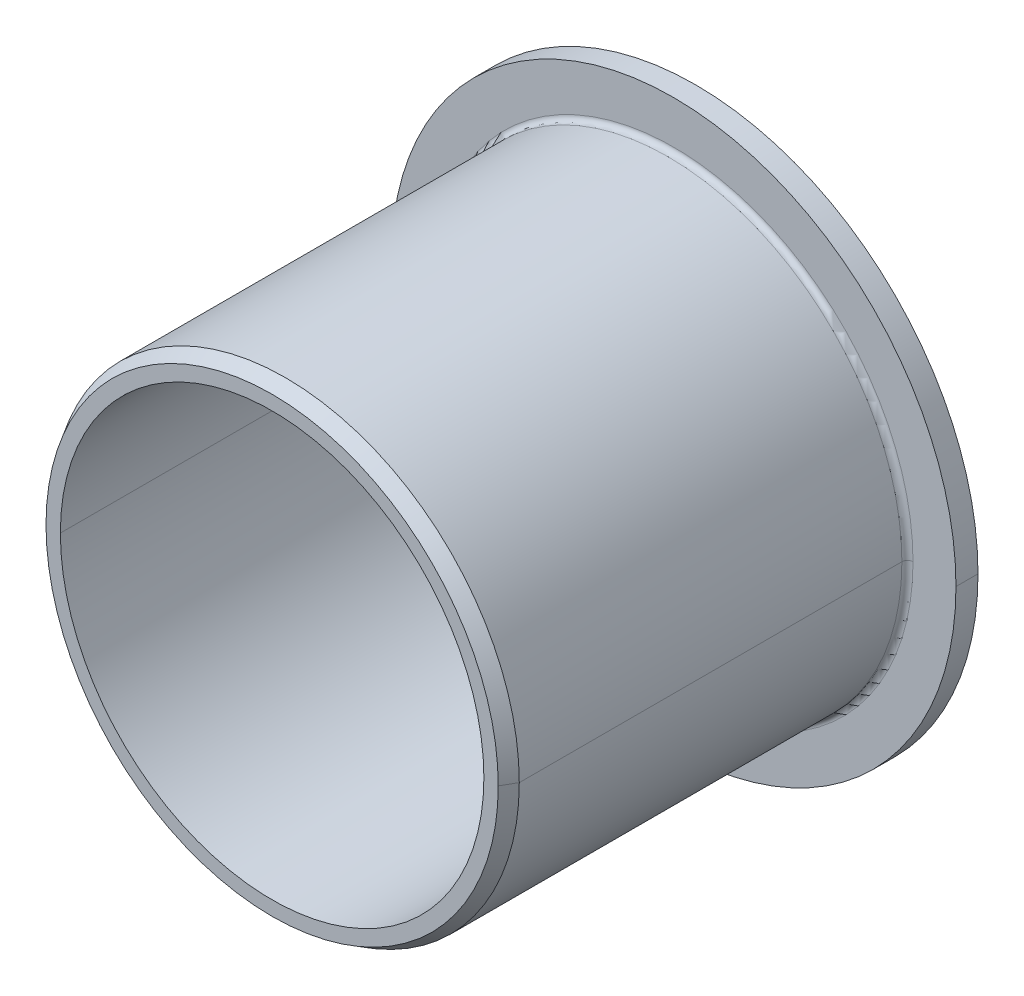
ISO-10303-21;
HEADER;
FILE_DESCRIPTION(('STEP AP214'),'2;1');
FILE_NAME('part.step','',(''),(''),'','','');
FILE_SCHEMA(('AUTOMOTIVE_DESIGN { 1 0 10303 214 1 1 1 1 }'));
ENDSEC;
DATA;
#1=APPLICATION_CONTEXT('core data for automotive mechanical design processes');
#2=APPLICATION_PROTOCOL_DEFINITION('international standard','automotive_design',2000,#1);
#3=PRODUCT_CONTEXT('',#1,'mechanical');
#4=PRODUCT('Part','Part','',(#3));
#5=PRODUCT_RELATED_PRODUCT_CATEGORY('part','',(#4));
#6=PRODUCT_DEFINITION_FORMATION('','',#4);
#7=PRODUCT_DEFINITION_CONTEXT('part definition',#1,'design');
#8=PRODUCT_DEFINITION('design','',#6,#7);
#9=PRODUCT_DEFINITION_SHAPE('','',#8);
#10=(LENGTH_UNIT() NAMED_UNIT(*) SI_UNIT(.MILLI.,.METRE.));
#11=(NAMED_UNIT(*) PLANE_ANGLE_UNIT() SI_UNIT($,.RADIAN.));
#12=(NAMED_UNIT(*) SI_UNIT($,.STERADIAN.) SOLID_ANGLE_UNIT());
#13=UNCERTAINTY_MEASURE_WITH_UNIT(LENGTH_MEASURE(1.E-05),#10,'distance_accuracy_value','');
#14=(GEOMETRIC_REPRESENTATION_CONTEXT(3) GLOBAL_UNCERTAINTY_ASSIGNED_CONTEXT((#13)) GLOBAL_UNIT_ASSIGNED_CONTEXT((#10,
#11,#12)) REPRESENTATION_CONTEXT('',''));
#15=CARTESIAN_POINT('',(0.,0.,0.));
#16=DIRECTION('',(0.,0.,1.));
#17=DIRECTION('',(1.,0.,0.));
#18=AXIS2_PLACEMENT_3D('',#15,#16,#17);
#19=CARTESIAN_POINT('',(22.225,0.,0.));
#20=DIRECTION('',(0.,0.,-1.));
#21=DIRECTION('',(0.,-1.,0.));
#22=AXIS2_PLACEMENT_3D('',#19,#20,#21);
#23=PLANE('',#22);
#24=CARTESIAN_POINT('',(0.,0.,0.));
#25=DIRECTION('',(0.,0.,1.));
#26=DIRECTION('',(1.,0.,0.));
#27=AXIS2_PLACEMENT_3D('',#24,#25,#26);
#28=CIRCLE('',#27,19.05);
#29=CARTESIAN_POINT('',(19.05,0.,0.));
#30=VERTEX_POINT('',#29);
#31=CARTESIAN_POINT('',(-19.05,0.,0.));
#32=VERTEX_POINT('',#31);
#33=EDGE_CURVE('E11',#30,#32,#28,.T.);
#34=ORIENTED_EDGE('',*,*,#33,.T.);
#35=CARTESIAN_POINT('',(0.,0.,0.));
#36=DIRECTION('',(0.,0.,1.));
#37=DIRECTION('',(1.,0.,0.));
#38=AXIS2_PLACEMENT_3D('',#35,#36,#37);
#39=CIRCLE('',#38,19.05);
#40=EDGE_CURVE('E163',#32,#30,#39,.T.);
#41=ORIENTED_EDGE('',*,*,#40,.T.);
#42=EDGE_LOOP('',(#34,#41));
#43=FACE_BOUND('',#42,.T.);
#44=CARTESIAN_POINT('',(0.,0.,0.));
#45=DIRECTION('',(0.,0.,1.));
#46=DIRECTION('',(1.,0.,0.));
#47=AXIS2_PLACEMENT_3D('',#44,#45,#46);
#48=CIRCLE('',#47,25.4);
#49=CARTESIAN_POINT('',(25.4,0.,0.));
#50=VERTEX_POINT('',#49);
#51=CARTESIAN_POINT('',(-25.4,0.,0.));
#52=VERTEX_POINT('',#51);
#53=EDGE_CURVE('E185',#50,#52,#48,.T.);
#54=ORIENTED_EDGE('',*,*,#53,.F.);
#55=CARTESIAN_POINT('',(0.,0.,0.));
#56=DIRECTION('',(0.,0.,1.));
#57=DIRECTION('',(1.,0.,0.));
#58=AXIS2_PLACEMENT_3D('',#55,#56,#57);
#59=CIRCLE('',#58,25.4);
#60=EDGE_CURVE('E160',#52,#50,#59,.T.);
#61=ORIENTED_EDGE('',*,*,#60,.F.);
#62=EDGE_LOOP('',(#54,#61));
#63=FACE_BOUND('',#62,.T.);
#64=ADVANCED_FACE('F16',(#43,#63),#23,.T.);
#65=CARTESIAN_POINT('',(0.,0.,19.05));
#66=DIRECTION('',(0.,0.,1.));
#67=DIRECTION('',(1.,0.,0.));
#68=AXIS2_PLACEMENT_3D('',#65,#66,#67);
#69=CYLINDRICAL_SURFACE('',#68,19.05);
#70=DIRECTION('',(0.,0.,1.));
#71=VECTOR('',#70,1.);
#72=CARTESIAN_POINT('',(19.05,0.,19.05));
#73=LINE('',#72,#71);
#74=CARTESIAN_POINT('',(19.05,0.,38.1));
#75=VERTEX_POINT('',#74);
#76=EDGE_CURVE('E167',#30,#75,#73,.T.);
#77=ORIENTED_EDGE('',*,*,#76,.T.);
#78=CARTESIAN_POINT('',(0.,0.,38.1));
#79=DIRECTION('',(0.,0.,1.));
#80=DIRECTION('',(1.,0.,0.));
#81=AXIS2_PLACEMENT_3D('',#78,#79,#80);
#82=CIRCLE('',#81,19.05);
#83=CARTESIAN_POINT('',(-19.05,0.,38.1));
#84=VERTEX_POINT('',#83);
#85=EDGE_CURVE('E27',#75,#84,#82,.T.);
#86=ORIENTED_EDGE('',*,*,#85,.T.);
#87=DIRECTION('',(0.,0.,-1.));
#88=VECTOR('',#87,1.);
#89=CARTESIAN_POINT('',(-19.05,0.,19.05));
#90=LINE('',#89,#88);
#91=EDGE_CURVE('E166',#84,#32,#90,.T.);
#92=ORIENTED_EDGE('',*,*,#91,.T.);
#93=ORIENTED_EDGE('',*,*,#33,.F.);
#94=EDGE_LOOP('',(#77,#86,#92,#93));
#95=FACE_BOUND('',#94,.T.);
#96=ADVANCED_FACE('F231',(#95),#69,.F.);
#97=CARTESIAN_POINT('',(19.6957773385,0.,38.1));
#98=DIRECTION('',(0.,0.,1.));
#99=DIRECTION('',(1.,0.,0.));
#100=AXIS2_PLACEMENT_3D('',#97,#98,#99);
#101=PLANE('',#100);
#102=ORIENTED_EDGE('',*,*,#85,.F.);
#103=CARTESIAN_POINT('',(0.,0.,38.1));
#104=DIRECTION('',(0.,0.,1.));
#105=DIRECTION('',(1.,0.,0.));
#106=AXIS2_PLACEMENT_3D('',#103,#104,#105);
#107=CIRCLE('',#106,19.05);
#108=EDGE_CURVE('E20',#84,#75,#107,.T.);
#109=ORIENTED_EDGE('',*,*,#108,.F.);
#110=EDGE_LOOP('',(#102,#109));
#111=FACE_BOUND('',#110,.T.);
#112=CARTESIAN_POINT('',(0.,0.,38.1));
#113=DIRECTION('',(0.,0.,1.));
#114=DIRECTION('',(1.,0.,0.));
#115=AXIS2_PLACEMENT_3D('',#112,#113,#114);
#116=CIRCLE('',#115,20.341554677);
#117=CARTESIAN_POINT('',(20.341554677,0.,38.1));
#118=VERTEX_POINT('',#117);
#119=CARTESIAN_POINT('',(-20.341554677,0.,38.1));
#120=VERTEX_POINT('',#119);
#121=EDGE_CURVE('E148',#118,#120,#116,.T.);
#122=ORIENTED_EDGE('',*,*,#121,.T.);
#123=CARTESIAN_POINT('',(0.,0.,38.1));
#124=DIRECTION('',(0.,0.,1.));
#125=DIRECTION('',(1.,0.,0.));
#126=AXIS2_PLACEMENT_3D('',#123,#124,#125);
#127=CIRCLE('',#126,20.341554677);
#128=EDGE_CURVE('E105',#120,#118,#127,.T.);
#129=ORIENTED_EDGE('',*,*,#128,.T.);
#130=EDGE_LOOP('',(#122,#129));
#131=FACE_BOUND('',#130,.T.);
#132=ADVANCED_FACE('F237',(#111,#131),#101,.T.);
#133=CARTESIAN_POINT('',(0.,0.,37.5));
#134=DIRECTION('',(0.,0.,-1.));
#135=DIRECTION('',(1.,0.,0.));
#136=AXIS2_PLACEMENT_3D('',#133,#134,#135);
#137=CONICAL_SURFACE('',#136,20.6879648385,0.523598775581078);
#138=DIRECTION('',(-0.499999999985086,0.,0.866025403793049));
#139=VECTOR('',#138,1.);
#140=CARTESIAN_POINT('',(20.6879648385,0.,37.5));
#141=LINE('',#140,#139);
#142=CARTESIAN_POINT('',(21.034375,0.,36.9));
#143=VERTEX_POINT('',#142);
#144=EDGE_CURVE('E184',#143,#118,#141,.T.);
#145=ORIENTED_EDGE('',*,*,#144,.T.);
#146=ORIENTED_EDGE('',*,*,#128,.F.);
#147=DIRECTION('',(-0.499999999985086,0.,-0.866025403793049));
#148=VECTOR('',#147,1.);
#149=CARTESIAN_POINT('',(-20.6879648385,0.,37.5));
#150=LINE('',#149,#148);
#151=CARTESIAN_POINT('',(-21.034375,0.,36.9));
#152=VERTEX_POINT('',#151);
#153=EDGE_CURVE('E154',#120,#152,#150,.T.);
#154=ORIENTED_EDGE('',*,*,#153,.T.);
#155=CARTESIAN_POINT('',(0.,0.,36.9));
#156=DIRECTION('',(0.,0.,1.));
#157=DIRECTION('',(1.,0.,0.));
#158=AXIS2_PLACEMENT_3D('',#155,#156,#157);
#159=CIRCLE('',#158,21.034375);
#160=EDGE_CURVE('E80',#152,#143,#159,.T.);
#161=ORIENTED_EDGE('',*,*,#160,.T.);
#162=EDGE_LOOP('',(#145,#146,#154,#161));
#163=FACE_BOUND('',#162,.T.);
#164=ADVANCED_FACE('F242',(#163),#137,.T.);
#165=CARTESIAN_POINT('',(0.,0.,19.6906));
#166=DIRECTION('',(0.,0.,1.));
#167=DIRECTION('',(1.,0.,0.));
#168=AXIS2_PLACEMENT_3D('',#165,#166,#167);
#169=CYLINDRICAL_SURFACE('',#168,21.034375);
#170=DIRECTION('',(0.,0.,1.));
#171=VECTOR('',#170,1.);
#172=CARTESIAN_POINT('',(21.034375,0.,19.6906));
#173=LINE('',#172,#171);
#174=CARTESIAN_POINT('',(21.034375,0.,2.4812));
#175=VERTEX_POINT('',#174);
#176=EDGE_CURVE('E116',#175,#143,#173,.T.);
#177=ORIENTED_EDGE('',*,*,#176,.T.);
#178=ORIENTED_EDGE('',*,*,#160,.F.);
#179=DIRECTION('',(0.,0.,-1.));
#180=VECTOR('',#179,1.);
#181=CARTESIAN_POINT('',(-21.034375,0.,19.6906));
#182=LINE('',#181,#180);
#183=CARTESIAN_POINT('',(-21.034375,0.,2.4812));
#184=VERTEX_POINT('',#183);
#185=EDGE_CURVE('E119',#152,#184,#182,.T.);
#186=ORIENTED_EDGE('',*,*,#185,.T.);
#187=CARTESIAN_POINT('',(0.,0.,2.4812));
#188=DIRECTION('',(0.,0.,1.));
#189=DIRECTION('',(1.,0.,0.));
#190=AXIS2_PLACEMENT_3D('',#187,#188,#189);
#191=CIRCLE('',#190,21.034375);
#192=EDGE_CURVE('E112',#184,#175,#191,.T.);
#193=ORIENTED_EDGE('',*,*,#192,.T.);
#194=EDGE_LOOP('',(#177,#178,#186,#193));
#195=FACE_BOUND('',#194,.T.);
#196=ADVANCED_FACE('F114',(#195),#169,.T.);
#197=CARTESIAN_POINT('',(0.,0.,2.4812));
#198=DIRECTION('',(0.,0.,1.));
#199=DIRECTION('',(1.,0.,0.));
#200=AXIS2_PLACEMENT_3D('',#197,#198,#199);
#201=TOROIDAL_SURFACE('',#200,21.534375,0.499999999999986);
#202=CARTESIAN_POINT('',(-21.534375,0.,2.4812));
#203=DIRECTION('',(0.,-1.,0.));
#204=DIRECTION('',(-1.,0.,0.));
#205=AXIS2_PLACEMENT_3D('',#202,#203,#204);
#206=CIRCLE('',#205,0.499999999999986);
#207=CARTESIAN_POINT('',(-21.534375,0.,1.9812));
#208=VERTEX_POINT('',#207);
#209=EDGE_CURVE('E139',#208,#184,#206,.T.);
#210=ORIENTED_EDGE('',*,*,#209,.T.);
#211=CARTESIAN_POINT('',(0.,0.,2.4812));
#212=DIRECTION('',(0.,0.,1.));
#213=DIRECTION('',(1.,0.,0.));
#214=AXIS2_PLACEMENT_3D('',#211,#212,#213);
#215=CIRCLE('',#214,21.034375);
#216=EDGE_CURVE('E137',#175,#184,#215,.T.);
#217=ORIENTED_EDGE('',*,*,#216,.F.);
#218=CARTESIAN_POINT('',(21.534375,0.,2.4812));
#219=DIRECTION('',(0.,-1.,0.));
#220=DIRECTION('',(1.,0.,0.));
#221=AXIS2_PLACEMENT_3D('',#218,#219,#220);
#222=CIRCLE('',#221,0.499999999999986);
#223=CARTESIAN_POINT('',(21.534375,0.,1.9812));
#224=VERTEX_POINT('',#223);
#225=EDGE_CURVE('E126',#175,#224,#222,.T.);
#226=ORIENTED_EDGE('',*,*,#225,.T.);
#227=CARTESIAN_POINT('',(0.,0.,1.9812));
#228=DIRECTION('',(0.,0.,1.));
#229=DIRECTION('',(1.,0.,0.));
#230=AXIS2_PLACEMENT_3D('',#227,#228,#229);
#231=CIRCLE('',#230,21.534375);
#232=EDGE_CURVE('E162',#224,#208,#231,.T.);
#233=ORIENTED_EDGE('',*,*,#232,.T.);
#234=EDGE_LOOP('',(#210,#217,#226,#233));
#235=FACE_BOUND('',#234,.T.);
#236=ADVANCED_FACE('F138',(#235),#201,.F.);
#237=CARTESIAN_POINT('',(23.4671875,0.,1.9812));
#238=DIRECTION('',(0.,0.,1.));
#239=DIRECTION('',(1.,0.,0.));
#240=AXIS2_PLACEMENT_3D('',#237,#238,#239);
#241=PLANE('',#240);
#242=ORIENTED_EDGE('',*,*,#232,.F.);
#243=CARTESIAN_POINT('',(0.,0.,1.9812));
#244=DIRECTION('',(0.,0.,1.));
#245=DIRECTION('',(1.,0.,0.));
#246=AXIS2_PLACEMENT_3D('',#243,#244,#245);
#247=CIRCLE('',#246,21.534375);
#248=EDGE_CURVE('E133',#208,#224,#247,.T.);
#249=ORIENTED_EDGE('',*,*,#248,.F.);
#250=EDGE_LOOP('',(#242,#249));
#251=FACE_BOUND('',#250,.T.);
#252=CARTESIAN_POINT('',(0.,0.,1.9812));
#253=DIRECTION('',(0.,0.,1.));
#254=DIRECTION('',(1.,0.,0.));
#255=AXIS2_PLACEMENT_3D('',#252,#253,#254);
#256=CIRCLE('',#255,25.4);
#257=CARTESIAN_POINT('',(25.4,0.,1.9812));
#258=VERTEX_POINT('',#257);
#259=CARTESIAN_POINT('',(-25.4,0.,1.9812));
#260=VERTEX_POINT('',#259);
#261=EDGE_CURVE('E169',#258,#260,#256,.T.);
#262=ORIENTED_EDGE('',*,*,#261,.T.);
#263=CARTESIAN_POINT('',(0.,0.,1.9812));
#264=DIRECTION('',(0.,0.,1.));
#265=DIRECTION('',(1.,0.,0.));
#266=AXIS2_PLACEMENT_3D('',#263,#264,#265);
#267=CIRCLE('',#266,25.4);
#268=EDGE_CURVE('E41',#260,#258,#267,.T.);
#269=ORIENTED_EDGE('',*,*,#268,.T.);
#270=EDGE_LOOP('',(#262,#269));
#271=FACE_BOUND('',#270,.T.);
#272=ADVANCED_FACE('F201',(#251,#271),#241,.T.);
#273=CARTESIAN_POINT('',(0.,0.,0.9906));
#274=DIRECTION('',(0.,0.,1.));
#275=DIRECTION('',(1.,0.,0.));
#276=AXIS2_PLACEMENT_3D('',#273,#274,#275);
#277=CYLINDRICAL_SURFACE('',#276,25.4);
#278=DIRECTION('',(0.,0.,1.));
#279=VECTOR('',#278,1.);
#280=CARTESIAN_POINT('',(25.4,0.,0.9906));
#281=LINE('',#280,#279);
#282=EDGE_CURVE('E125',#50,#258,#281,.T.);
#283=ORIENTED_EDGE('',*,*,#282,.T.);
#284=ORIENTED_EDGE('',*,*,#268,.F.);
#285=DIRECTION('',(0.,0.,-1.));
#286=VECTOR('',#285,1.);
#287=CARTESIAN_POINT('',(-25.4,0.,0.9906));
#288=LINE('',#287,#286);
#289=EDGE_CURVE('E158',#260,#52,#288,.T.);
#290=ORIENTED_EDGE('',*,*,#289,.T.);
#291=ORIENTED_EDGE('',*,*,#60,.T.);
#292=EDGE_LOOP('',(#283,#284,#290,#291));
#293=FACE_BOUND('',#292,.T.);
#294=ADVANCED_FACE('F18',(#293),#277,.T.);
#295=CARTESIAN_POINT('',(0.,0.,0.9906));
#296=DIRECTION('',(0.,0.,1.));
#297=DIRECTION('',(1.,0.,0.));
#298=AXIS2_PLACEMENT_3D('',#295,#296,#297);
#299=CYLINDRICAL_SURFACE('',#298,25.4);
#300=ORIENTED_EDGE('',*,*,#282,.F.);
#301=ORIENTED_EDGE('',*,*,#53,.T.);
#302=ORIENTED_EDGE('',*,*,#289,.F.);
#303=ORIENTED_EDGE('',*,*,#261,.F.);
#304=EDGE_LOOP('',(#300,#301,#302,#303));
#305=FACE_BOUND('',#304,.T.);
#306=ADVANCED_FACE('F214',(#305),#299,.T.);
#307=CARTESIAN_POINT('',(0.,0.,2.4812));
#308=DIRECTION('',(0.,0.,1.));
#309=DIRECTION('',(1.,0.,0.));
#310=AXIS2_PLACEMENT_3D('',#307,#308,#309);
#311=TOROIDAL_SURFACE('',#310,21.534375,0.499999999999986);
#312=ORIENTED_EDGE('',*,*,#209,.F.);
#313=ORIENTED_EDGE('',*,*,#248,.T.);
#314=ORIENTED_EDGE('',*,*,#225,.F.);
#315=ORIENTED_EDGE('',*,*,#192,.F.);
#316=EDGE_LOOP('',(#312,#313,#314,#315));
#317=FACE_BOUND('',#316,.T.);
#318=ADVANCED_FACE('F131',(#317),#311,.F.);
#319=CARTESIAN_POINT('',(0.,0.,19.6906));
#320=DIRECTION('',(0.,0.,1.));
#321=DIRECTION('',(1.,0.,0.));
#322=AXIS2_PLACEMENT_3D('',#319,#320,#321);
#323=CYLINDRICAL_SURFACE('',#322,21.034375);
#324=ORIENTED_EDGE('',*,*,#176,.F.);
#325=ORIENTED_EDGE('',*,*,#216,.T.);
#326=ORIENTED_EDGE('',*,*,#185,.F.);
#327=CARTESIAN_POINT('',(0.,0.,36.9));
#328=DIRECTION('',(0.,0.,1.));
#329=DIRECTION('',(1.,0.,0.));
#330=AXIS2_PLACEMENT_3D('',#327,#328,#329);
#331=CIRCLE('',#330,21.034375);
#332=EDGE_CURVE('E145',#143,#152,#331,.T.);
#333=ORIENTED_EDGE('',*,*,#332,.F.);
#334=EDGE_LOOP('',(#324,#325,#326,#333));
#335=FACE_BOUND('',#334,.T.);
#336=ADVANCED_FACE('F143',(#335),#323,.T.);
#337=CARTESIAN_POINT('',(0.,0.,37.5));
#338=DIRECTION('',(0.,0.,-1.));
#339=DIRECTION('',(1.,0.,0.));
#340=AXIS2_PLACEMENT_3D('',#337,#338,#339);
#341=CONICAL_SURFACE('',#340,20.6879648385,0.523598775581078);
#342=ORIENTED_EDGE('',*,*,#144,.F.);
#343=ORIENTED_EDGE('',*,*,#332,.T.);
#344=ORIENTED_EDGE('',*,*,#153,.F.);
#345=ORIENTED_EDGE('',*,*,#121,.F.);
#346=EDGE_LOOP('',(#342,#343,#344,#345));
#347=FACE_BOUND('',#346,.T.);
#348=ADVANCED_FACE('F247',(#347),#341,.T.);
#349=CARTESIAN_POINT('',(0.,0.,19.05));
#350=DIRECTION('',(0.,0.,1.));
#351=DIRECTION('',(1.,0.,0.));
#352=AXIS2_PLACEMENT_3D('',#349,#350,#351);
#353=CYLINDRICAL_SURFACE('',#352,19.05);
#354=ORIENTED_EDGE('',*,*,#76,.F.);
#355=ORIENTED_EDGE('',*,*,#40,.F.);
#356=ORIENTED_EDGE('',*,*,#91,.F.);
#357=ORIENTED_EDGE('',*,*,#108,.T.);
#358=EDGE_LOOP('',(#354,#355,#356,#357));
#359=FACE_BOUND('',#358,.T.);
#360=ADVANCED_FACE('F245',(#359),#353,.F.);
#361=CLOSED_SHELL('',(#64,#96,#132,#164,#196,#236,#272,#294,#306,#318,#336,#348,#360));
#362=MANIFOLD_SOLID_BREP('B1',#361);
#363=ADVANCED_BREP_SHAPE_REPRESENTATION('',(#18,#362),#14);
#364=SHAPE_DEFINITION_REPRESENTATION(#9,#363);
ENDSEC;
END-ISO-10303-21;
